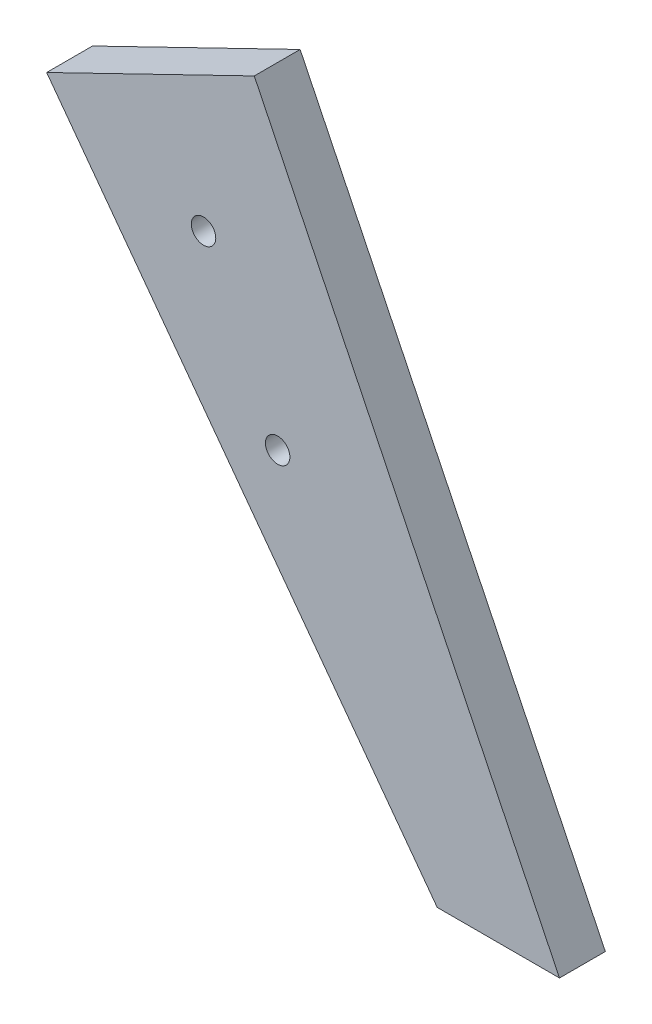
ISO-10303-21;
HEADER;
FILE_DESCRIPTION(('STEP AP214'),'2;1');
FILE_NAME('part.step','',(''),(''),'','','');
FILE_SCHEMA(('AUTOMOTIVE_DESIGN { 1 0 10303 214 1 1 1 1 }'));
ENDSEC;
DATA;
#1=APPLICATION_CONTEXT('core data for automotive mechanical design processes');
#2=APPLICATION_PROTOCOL_DEFINITION('international standard','automotive_design',2000,#1);
#3=PRODUCT_CONTEXT('',#1,'mechanical');
#4=PRODUCT('Part','Part','',(#3));
#5=PRODUCT_RELATED_PRODUCT_CATEGORY('part','',(#4));
#6=PRODUCT_DEFINITION_FORMATION('','',#4);
#7=PRODUCT_DEFINITION_CONTEXT('part definition',#1,'design');
#8=PRODUCT_DEFINITION('design','',#6,#7);
#9=PRODUCT_DEFINITION_SHAPE('','',#8);
#10=(LENGTH_UNIT() NAMED_UNIT(*) SI_UNIT(.MILLI.,.METRE.));
#11=(NAMED_UNIT(*) PLANE_ANGLE_UNIT() SI_UNIT($,.RADIAN.));
#12=(NAMED_UNIT(*) SI_UNIT($,.STERADIAN.) SOLID_ANGLE_UNIT());
#13=UNCERTAINTY_MEASURE_WITH_UNIT(LENGTH_MEASURE(1.E-05),#10,'distance_accuracy_value','');
#14=(GEOMETRIC_REPRESENTATION_CONTEXT(3) GLOBAL_UNCERTAINTY_ASSIGNED_CONTEXT((#13)) GLOBAL_UNIT_ASSIGNED_CONTEXT((#10,
#11,#12)) REPRESENTATION_CONTEXT('',''));
#15=CARTESIAN_POINT('',(0.,0.,0.));
#16=DIRECTION('',(0.,0.,1.));
#17=DIRECTION('',(1.,0.,0.));
#18=AXIS2_PLACEMENT_3D('',#15,#16,#17);
#19=CARTESIAN_POINT('',(0.,0.,6.));
#20=DIRECTION('',(0.,0.,-1.));
#21=DIRECTION('',(-1.,0.,0.));
#22=AXIS2_PLACEMENT_3D('',#19,#20,#21);
#23=PLANE('',#22);
#24=DIRECTION('',(0.594854364721613,-0.803833493188513,0.));
#25=VECTOR('',#24,1.);
#26=CARTESIAN_POINT('',(30.5755356082009,-61.35,6.));
#27=LINE('',#26,#25);
#28=CARTESIAN_POINT('',(-20.5284296371843,7.707371577339,6.));
#29=VERTEX_POINT('',#28);
#30=CARTESIAN_POINT('',(30.5755356082009,-61.35,6.));
#31=VERTEX_POINT('',#30);
#32=EDGE_CURVE('E93',#29,#31,#27,.T.);
#33=ORIENTED_EDGE('',*,*,#32,.T.);
#34=DIRECTION('',(1.,0.,0.));
#35=VECTOR('',#34,1.);
#36=CARTESIAN_POINT('',(46.5755356082009,-61.35,6.));
#37=LINE('',#36,#35);
#38=CARTESIAN_POINT('',(46.5755356082009,-61.35,6.));
#39=VERTEX_POINT('',#38);
#40=EDGE_CURVE('E88',#31,#39,#37,.T.);
#41=ORIENTED_EDGE('',*,*,#40,.T.);
#42=DIRECTION('',(-0.436796972699579,0.899560117302053,0.));
#43=VECTOR('',#42,1.);
#44=CARTESIAN_POINT('',(6.63828590533769,20.8986401528663,6.));
#45=LINE('',#44,#43);
#46=CARTESIAN_POINT('',(6.63828590533769,20.8986401528663,6.));
#47=VERTEX_POINT('',#46);
#48=EDGE_CURVE('E90',#39,#47,#45,.T.);
#49=ORIENTED_EDGE('',*,*,#48,.T.);
#50=DIRECTION('',(-0.899560117302053,-0.436796972699579,0.));
#51=VECTOR('',#50,1.);
#52=CARTESIAN_POINT('',(-20.5284296371843,7.707371577339,6.));
#53=LINE('',#52,#51);
#54=EDGE_CURVE('E57',#47,#29,#53,.T.);
#55=ORIENTED_EDGE('',*,*,#54,.T.);
#56=EDGE_LOOP('',(#33,#41,#49,#55));
#57=FACE_BOUND('',#56,.T.);
#58=CARTESIAN_POINT('',(0.,0.,6.));
#59=DIRECTION('',(0.,0.,1.));
#60=DIRECTION('',(1.,0.,0.));
#61=AXIS2_PLACEMENT_3D('',#58,#59,#60);
#62=CIRCLE('',#61,1.6);
#63=CARTESIAN_POINT('',(1.6,0.,6.));
#64=VERTEX_POINT('',#63);
#65=EDGE_CURVE('E106',#64,#64,#62,.T.);
#66=ORIENTED_EDGE('',*,*,#65,.F.);
#67=EDGE_LOOP('',(#66));
#68=FACE_BOUND('',#67,.T.);
#69=CARTESIAN_POINT('',(9.69689279393065,-19.9702346041056,6.));
#70=DIRECTION('',(0.,0.,1.));
#71=DIRECTION('',(1.,0.,0.));
#72=AXIS2_PLACEMENT_3D('',#69,#70,#71);
#73=CIRCLE('',#72,1.6);
#74=CARTESIAN_POINT('',(11.2968927939307,-19.9702346041056,6.));
#75=VERTEX_POINT('',#74);
#76=EDGE_CURVE('E121',#75,#75,#73,.T.);
#77=ORIENTED_EDGE('',*,*,#76,.F.);
#78=EDGE_LOOP('',(#77));
#79=FACE_BOUND('',#78,.T.);
#80=ADVANCED_FACE('F39',(#57,#68,#79),#23,.F.);
#81=CARTESIAN_POINT('',(0.,0.,0.));
#82=DIRECTION('',(0.,0.,-1.));
#83=DIRECTION('',(-1.,0.,0.));
#84=AXIS2_PLACEMENT_3D('',#81,#82,#83);
#85=PLANE('',#84);
#86=CARTESIAN_POINT('',(0.,0.,0.));
#87=DIRECTION('',(0.,0.,1.));
#88=DIRECTION('',(1.,0.,0.));
#89=AXIS2_PLACEMENT_3D('',#86,#87,#88);
#90=CIRCLE('',#89,1.6);
#91=CARTESIAN_POINT('',(1.6,0.,0.));
#92=VERTEX_POINT('',#91);
#93=EDGE_CURVE('E119',#92,#92,#90,.T.);
#94=ORIENTED_EDGE('',*,*,#93,.T.);
#95=EDGE_LOOP('',(#94));
#96=FACE_BOUND('',#95,.T.);
#97=DIRECTION('',(0.594854364721613,-0.803833493188513,0.));
#98=VECTOR('',#97,1.);
#99=CARTESIAN_POINT('',(30.5755356082009,-61.35,0.));
#100=LINE('',#99,#98);
#101=CARTESIAN_POINT('',(-20.5284296371843,7.707371577339,0.));
#102=VERTEX_POINT('',#101);
#103=CARTESIAN_POINT('',(30.5755356082009,-61.35,0.));
#104=VERTEX_POINT('',#103);
#105=EDGE_CURVE('E103',#102,#104,#100,.T.);
#106=ORIENTED_EDGE('',*,*,#105,.F.);
#107=DIRECTION('',(-0.899560117302053,-0.436796972699579,0.));
#108=VECTOR('',#107,1.);
#109=CARTESIAN_POINT('',(-20.5284296371843,7.707371577339,0.));
#110=LINE('',#109,#108);
#111=CARTESIAN_POINT('',(6.63828590533769,20.8986401528663,0.));
#112=VERTEX_POINT('',#111);
#113=EDGE_CURVE('E76',#112,#102,#110,.T.);
#114=ORIENTED_EDGE('',*,*,#113,.F.);
#115=DIRECTION('',(-0.436796972699579,0.899560117302053,0.));
#116=VECTOR('',#115,1.);
#117=CARTESIAN_POINT('',(6.63828590533769,20.8986401528663,0.));
#118=LINE('',#117,#116);
#119=CARTESIAN_POINT('',(46.5755356082009,-61.35,0.));
#120=VERTEX_POINT('',#119);
#121=EDGE_CURVE('E71',#120,#112,#118,.T.);
#122=ORIENTED_EDGE('',*,*,#121,.F.);
#123=DIRECTION('',(1.,0.,0.));
#124=VECTOR('',#123,1.);
#125=CARTESIAN_POINT('',(46.5755356082009,-61.35,0.));
#126=LINE('',#125,#124);
#127=EDGE_CURVE('E92',#104,#120,#126,.T.);
#128=ORIENTED_EDGE('',*,*,#127,.F.);
#129=EDGE_LOOP('',(#106,#114,#122,#128));
#130=FACE_BOUND('',#129,.T.);
#131=CARTESIAN_POINT('',(9.69689279393065,-19.9702346041056,0.));
#132=DIRECTION('',(0.,0.,1.));
#133=DIRECTION('',(1.,0.,0.));
#134=AXIS2_PLACEMENT_3D('',#131,#132,#133);
#135=CIRCLE('',#134,1.6);
#136=CARTESIAN_POINT('',(11.2968927939307,-19.9702346041056,0.));
#137=VERTEX_POINT('',#136);
#138=EDGE_CURVE('E123',#137,#137,#135,.T.);
#139=ORIENTED_EDGE('',*,*,#138,.T.);
#140=EDGE_LOOP('',(#139));
#141=FACE_BOUND('',#140,.T.);
#142=ADVANCED_FACE('F111',(#96,#130,#141),#85,.T.);
#143=CARTESIAN_POINT('',(30.5755356082009,-61.35,6.));
#144=DIRECTION('',(0.803833493188512,0.594854364721613,0.));
#145=DIRECTION('',(-0.594854364721613,0.803833493188513,0.));
#146=AXIS2_PLACEMENT_3D('',#143,#144,#145);
#147=PLANE('',#146);
#148=ORIENTED_EDGE('',*,*,#105,.T.);
#149=DIRECTION('',(0.,0.,-1.));
#150=VECTOR('',#149,1.);
#151=CARTESIAN_POINT('',(30.5755356082009,-61.35,6.));
#152=LINE('',#151,#150);
#153=EDGE_CURVE('E11',#31,#104,#152,.T.);
#154=ORIENTED_EDGE('',*,*,#153,.F.);
#155=ORIENTED_EDGE('',*,*,#32,.F.);
#156=DIRECTION('',(0.,0.,-1.));
#157=VECTOR('',#156,1.);
#158=CARTESIAN_POINT('',(-20.5284296371843,7.707371577339,6.));
#159=LINE('',#158,#157);
#160=EDGE_CURVE('E97',#29,#102,#159,.T.);
#161=ORIENTED_EDGE('',*,*,#160,.T.);
#162=EDGE_LOOP('',(#148,#154,#155,#161));
#163=FACE_BOUND('',#162,.T.);
#164=ADVANCED_FACE('F41',(#163),#147,.F.);
#165=CARTESIAN_POINT('',(46.5755356082009,-61.35,6.));
#166=DIRECTION('',(0.,1.,0.));
#167=DIRECTION('',(0.,0.,1.));
#168=AXIS2_PLACEMENT_3D('',#165,#166,#167);
#169=PLANE('',#168);
#170=ORIENTED_EDGE('',*,*,#127,.T.);
#171=DIRECTION('',(0.,0.,-1.));
#172=VECTOR('',#171,1.);
#173=CARTESIAN_POINT('',(46.5755356082009,-61.35,6.));
#174=LINE('',#173,#172);
#175=EDGE_CURVE('E48',#39,#120,#174,.T.);
#176=ORIENTED_EDGE('',*,*,#175,.F.);
#177=ORIENTED_EDGE('',*,*,#40,.F.);
#178=ORIENTED_EDGE('',*,*,#153,.T.);
#179=EDGE_LOOP('',(#170,#176,#177,#178));
#180=FACE_BOUND('',#179,.T.);
#181=ADVANCED_FACE('F94',(#180),#169,.F.);
#182=CARTESIAN_POINT('',(6.63828590533769,20.8986401528663,6.));
#183=DIRECTION('',(-0.899560117302053,-0.436796972699579,0.));
#184=DIRECTION('',(0.436796972699579,-0.899560117302053,0.));
#185=AXIS2_PLACEMENT_3D('',#182,#183,#184);
#186=PLANE('',#185);
#187=ORIENTED_EDGE('',*,*,#121,.T.);
#188=DIRECTION('',(0.,0.,-1.));
#189=VECTOR('',#188,1.);
#190=CARTESIAN_POINT('',(6.63828590533769,20.8986401528663,6.));
#191=LINE('',#190,#189);
#192=EDGE_CURVE('E96',#47,#112,#191,.T.);
#193=ORIENTED_EDGE('',*,*,#192,.F.);
#194=ORIENTED_EDGE('',*,*,#48,.F.);
#195=ORIENTED_EDGE('',*,*,#175,.T.);
#196=EDGE_LOOP('',(#187,#193,#194,#195));
#197=FACE_BOUND('',#196,.T.);
#198=ADVANCED_FACE('F100',(#197),#186,.F.);
#199=CARTESIAN_POINT('',(-20.5284296371843,7.707371577339,6.));
#200=DIRECTION('',(0.436796972699579,-0.899560117302053,0.));
#201=DIRECTION('',(0.899560117302053,0.436796972699579,0.));
#202=AXIS2_PLACEMENT_3D('',#199,#200,#201);
#203=PLANE('',#202);
#204=ORIENTED_EDGE('',*,*,#113,.T.);
#205=ORIENTED_EDGE('',*,*,#160,.F.);
#206=ORIENTED_EDGE('',*,*,#54,.F.);
#207=ORIENTED_EDGE('',*,*,#192,.T.);
#208=EDGE_LOOP('',(#204,#205,#206,#207));
#209=FACE_BOUND('',#208,.T.);
#210=ADVANCED_FACE('F112',(#209),#203,.F.);
#211=CARTESIAN_POINT('',(0.,0.,6.));
#212=DIRECTION('',(0.,0.,-1.));
#213=DIRECTION('',(-1.,0.,0.));
#214=AXIS2_PLACEMENT_3D('',#211,#212,#213);
#215=CYLINDRICAL_SURFACE('',#214,1.6);
#216=ORIENTED_EDGE('',*,*,#65,.T.);
#217=EDGE_LOOP('',(#216));
#218=FACE_BOUND('',#217,.T.);
#219=ORIENTED_EDGE('',*,*,#93,.F.);
#220=EDGE_LOOP('',(#219));
#221=FACE_BOUND('',#220,.T.);
#222=ADVANCED_FACE('F143',(#218,#221),#215,.F.);
#223=CARTESIAN_POINT('',(9.69689279393065,-19.9702346041056,6.));
#224=DIRECTION('',(0.,0.,-1.));
#225=DIRECTION('',(-1.,0.,0.));
#226=AXIS2_PLACEMENT_3D('',#223,#224,#225);
#227=CYLINDRICAL_SURFACE('',#226,1.6);
#228=ORIENTED_EDGE('',*,*,#76,.T.);
#229=EDGE_LOOP('',(#228));
#230=FACE_BOUND('',#229,.T.);
#231=ORIENTED_EDGE('',*,*,#138,.F.);
#232=EDGE_LOOP('',(#231));
#233=FACE_BOUND('',#232,.T.);
#234=ADVANCED_FACE('F128',(#230,#233),#227,.F.);
#235=CLOSED_SHELL('',(#80,#142,#164,#181,#198,#210,#222,#234));
#236=MANIFOLD_SOLID_BREP('B2',#235);
#237=ADVANCED_BREP_SHAPE_REPRESENTATION('',(#18,#236),#14);
#238=SHAPE_DEFINITION_REPRESENTATION(#9,#237);
ENDSEC;
END-ISO-10303-21;
